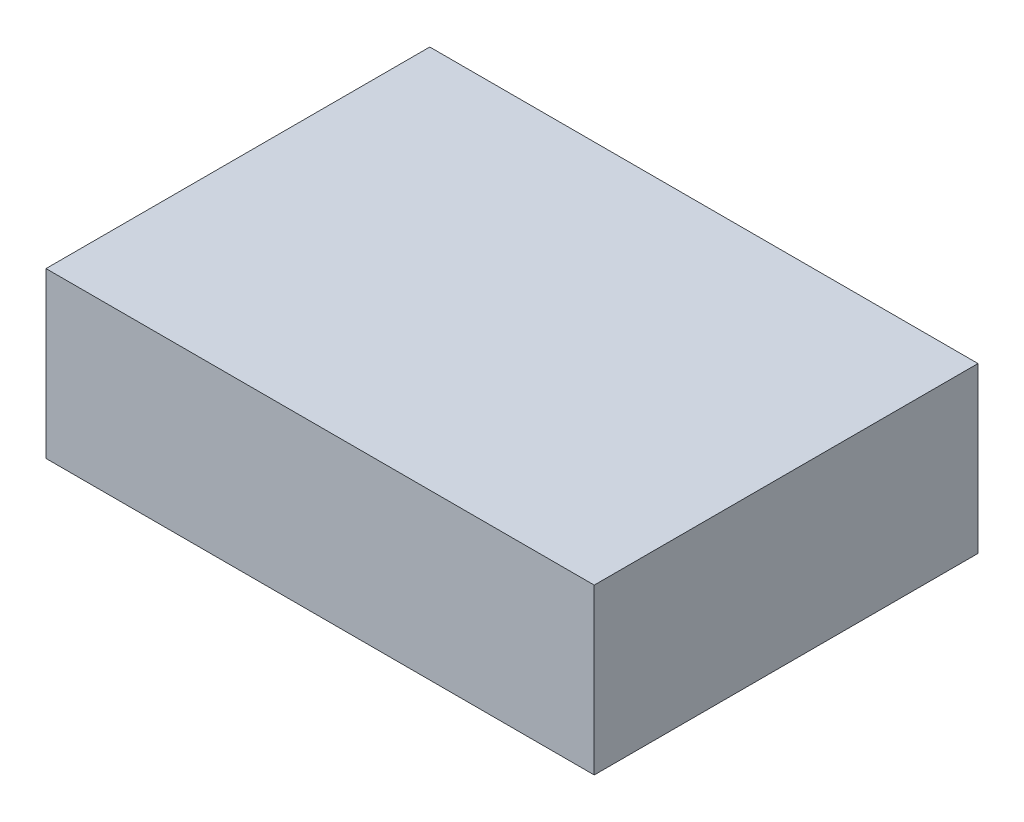
ISO-10303-21;
HEADER;
FILE_DESCRIPTION(('STEP AP214'),'2;1');
FILE_NAME('part.step','',(''),(''),'','','');
FILE_SCHEMA(('AUTOMOTIVE_DESIGN { 1 0 10303 214 1 1 1 1 }'));
ENDSEC;
DATA;
#1=APPLICATION_CONTEXT('core data for automotive mechanical design processes');
#2=APPLICATION_PROTOCOL_DEFINITION('international standard','automotive_design',2000,#1);
#3=PRODUCT_CONTEXT('',#1,'mechanical');
#4=PRODUCT('Part','Part','',(#3));
#5=PRODUCT_RELATED_PRODUCT_CATEGORY('part','',(#4));
#6=PRODUCT_DEFINITION_FORMATION('','',#4);
#7=PRODUCT_DEFINITION_CONTEXT('part definition',#1,'design');
#8=PRODUCT_DEFINITION('design','',#6,#7);
#9=PRODUCT_DEFINITION_SHAPE('','',#8);
#10=(LENGTH_UNIT() NAMED_UNIT(*) SI_UNIT(.MILLI.,.METRE.));
#11=(NAMED_UNIT(*) PLANE_ANGLE_UNIT() SI_UNIT($,.RADIAN.));
#12=(NAMED_UNIT(*) SI_UNIT($,.STERADIAN.) SOLID_ANGLE_UNIT());
#13=UNCERTAINTY_MEASURE_WITH_UNIT(LENGTH_MEASURE(1.E-05),#10,'distance_accuracy_value','');
#14=(GEOMETRIC_REPRESENTATION_CONTEXT(3) GLOBAL_UNCERTAINTY_ASSIGNED_CONTEXT((#13)) GLOBAL_UNIT_ASSIGNED_CONTEXT((#10,
#11,#12)) REPRESENTATION_CONTEXT('',''));
#15=CARTESIAN_POINT('',(0.,0.,0.));
#16=DIRECTION('',(0.,0.,1.));
#17=DIRECTION('',(1.,0.,0.));
#18=AXIS2_PLACEMENT_3D('',#15,#16,#17);
#19=CARTESIAN_POINT('',(-56.2982085514118,30.,-44.7528652372535));
#20=DIRECTION('',(1.,0.,0.));
#21=DIRECTION('',(0.,0.,-1.));
#22=AXIS2_PLACEMENT_3D('',#19,#20,#21);
#23=PLANE('',#22);
#24=DIRECTION('',(0.,0.,1.));
#25=VECTOR('',#24,1.);
#26=CARTESIAN_POINT('',(-56.2982085514118,0.,-44.7528652372535));
#27=LINE('',#26,#25);
#28=CARTESIAN_POINT('',(-56.2982085514118,0.,-44.7528652372535));
#29=VERTEX_POINT('',#28);
#30=CARTESIAN_POINT('',(-56.2982085514118,0.,25.2471347627465));
#31=VERTEX_POINT('',#30);
#32=EDGE_CURVE('E103',#29,#31,#27,.T.);
#33=ORIENTED_EDGE('',*,*,#32,.T.);
#34=DIRECTION('',(0.,-1.,0.));
#35=VECTOR('',#34,1.);
#36=CARTESIAN_POINT('',(-56.2982085514118,30.,25.2471347627465));
#37=LINE('',#36,#35);
#38=CARTESIAN_POINT('',(-56.2982085514118,30.,25.2471347627465));
#39=VERTEX_POINT('',#38);
#40=EDGE_CURVE('E11',#39,#31,#37,.T.);
#41=ORIENTED_EDGE('',*,*,#40,.F.);
#42=DIRECTION('',(0.,0.,1.));
#43=VECTOR('',#42,1.);
#44=CARTESIAN_POINT('',(-56.2982085514118,30.,-44.7528652372535));
#45=LINE('',#44,#43);
#46=CARTESIAN_POINT('',(-56.2982085514118,30.,-44.7528652372535));
#47=VERTEX_POINT('',#46);
#48=EDGE_CURVE('E89',#47,#39,#45,.T.);
#49=ORIENTED_EDGE('',*,*,#48,.F.);
#50=DIRECTION('',(0.,-1.,0.));
#51=VECTOR('',#50,1.);
#52=CARTESIAN_POINT('',(-56.2982085514118,30.,-44.7528652372535));
#53=LINE('',#52,#51);
#54=EDGE_CURVE('E56',#47,#29,#53,.T.);
#55=ORIENTED_EDGE('',*,*,#54,.T.);
#56=EDGE_LOOP('',(#33,#41,#49,#55));
#57=FACE_BOUND('',#56,.T.);
#58=ADVANCED_FACE('F40',(#57),#23,.F.);
#59=CARTESIAN_POINT('',(-56.2982085514118,30.,25.2471347627465));
#60=DIRECTION('',(0.,0.,-1.));
#61=DIRECTION('',(-1.,0.,0.));
#62=AXIS2_PLACEMENT_3D('',#59,#60,#61);
#63=PLANE('',#62);
#64=DIRECTION('',(1.,0.,0.));
#65=VECTOR('',#64,1.);
#66=CARTESIAN_POINT('',(-56.2982085514118,0.,25.2471347627465));
#67=LINE('',#66,#65);
#68=CARTESIAN_POINT('',(43.7017914485883,0.,25.2471347627465));
#69=VERTEX_POINT('',#68);
#70=EDGE_CURVE('E94',#31,#69,#67,.T.);
#71=ORIENTED_EDGE('',*,*,#70,.T.);
#72=DIRECTION('',(0.,-1.,0.));
#73=VECTOR('',#72,1.);
#74=CARTESIAN_POINT('',(43.7017914485883,30.,25.2471347627465));
#75=LINE('',#74,#73);
#76=CARTESIAN_POINT('',(43.7017914485883,30.,25.2471347627465));
#77=VERTEX_POINT('',#76);
#78=EDGE_CURVE('E48',#77,#69,#75,.T.);
#79=ORIENTED_EDGE('',*,*,#78,.F.);
#80=DIRECTION('',(1.,0.,0.));
#81=VECTOR('',#80,1.);
#82=CARTESIAN_POINT('',(-56.2982085514118,30.,25.2471347627465));
#83=LINE('',#82,#81);
#84=EDGE_CURVE('E81',#39,#77,#83,.T.);
#85=ORIENTED_EDGE('',*,*,#84,.F.);
#86=ORIENTED_EDGE('',*,*,#40,.T.);
#87=EDGE_LOOP('',(#71,#79,#85,#86));
#88=FACE_BOUND('',#87,.T.);
#89=ADVANCED_FACE('F93',(#88),#63,.F.);
#90=CARTESIAN_POINT('',(43.7017914485882,30.,-44.7528652372535));
#91=DIRECTION('',(1.,0.,0.));
#92=DIRECTION('',(0.,0.,-1.));
#93=AXIS2_PLACEMENT_3D('',#90,#91,#92);
#94=PLANE('',#93);
#95=DIRECTION('',(0.,0.,1.));
#96=VECTOR('',#95,1.);
#97=CARTESIAN_POINT('',(43.7017914485882,0.,-44.7528652372535));
#98=LINE('',#97,#96);
#99=CARTESIAN_POINT('',(43.7017914485882,0.,-44.7528652372535));
#100=VERTEX_POINT('',#99);
#101=EDGE_CURVE('E106',#100,#69,#98,.T.);
#102=ORIENTED_EDGE('',*,*,#101,.F.);
#103=DIRECTION('',(0.,-1.,0.));
#104=VECTOR('',#103,1.);
#105=CARTESIAN_POINT('',(43.7017914485882,30.,-44.7528652372535));
#106=LINE('',#105,#104);
#107=CARTESIAN_POINT('',(43.7017914485882,30.,-44.7528652372535));
#108=VERTEX_POINT('',#107);
#109=EDGE_CURVE('E70',#108,#100,#106,.T.);
#110=ORIENTED_EDGE('',*,*,#109,.F.);
#111=DIRECTION('',(0.,0.,1.));
#112=VECTOR('',#111,1.);
#113=CARTESIAN_POINT('',(43.7017914485882,30.,-44.7528652372535));
#114=LINE('',#113,#112);
#115=EDGE_CURVE('E88',#108,#77,#114,.T.);
#116=ORIENTED_EDGE('',*,*,#115,.T.);
#117=ORIENTED_EDGE('',*,*,#78,.T.);
#118=EDGE_LOOP('',(#102,#110,#116,#117));
#119=FACE_BOUND('',#118,.T.);
#120=ADVANCED_FACE('F97',(#119),#94,.T.);
#121=CARTESIAN_POINT('',(-56.2982085514118,30.,-44.7528652372535));
#122=DIRECTION('',(0.,0.,-1.));
#123=DIRECTION('',(-1.,0.,0.));
#124=AXIS2_PLACEMENT_3D('',#121,#122,#123);
#125=PLANE('',#124);
#126=DIRECTION('',(1.,0.,0.));
#127=VECTOR('',#126,1.);
#128=CARTESIAN_POINT('',(-56.2982085514118,0.,-44.7528652372535));
#129=LINE('',#128,#127);
#130=EDGE_CURVE('E108',#29,#100,#129,.T.);
#131=ORIENTED_EDGE('',*,*,#130,.F.);
#132=ORIENTED_EDGE('',*,*,#54,.F.);
#133=DIRECTION('',(1.,0.,0.));
#134=VECTOR('',#133,1.);
#135=CARTESIAN_POINT('',(-56.2982085514118,30.,-44.7528652372535));
#136=LINE('',#135,#134);
#137=EDGE_CURVE('E98',#47,#108,#136,.T.);
#138=ORIENTED_EDGE('',*,*,#137,.T.);
#139=ORIENTED_EDGE('',*,*,#109,.T.);
#140=EDGE_LOOP('',(#131,#132,#138,#139));
#141=FACE_BOUND('',#140,.T.);
#142=ADVANCED_FACE('F114',(#141),#125,.T.);
#143=CARTESIAN_POINT('',(0.,30.,0.));
#144=DIRECTION('',(0.,1.,0.));
#145=DIRECTION('',(0.,0.,1.));
#146=AXIS2_PLACEMENT_3D('',#143,#144,#145);
#147=PLANE('',#146);
#148=ORIENTED_EDGE('',*,*,#48,.T.);
#149=ORIENTED_EDGE('',*,*,#84,.T.);
#150=ORIENTED_EDGE('',*,*,#115,.F.);
#151=ORIENTED_EDGE('',*,*,#137,.F.);
#152=EDGE_LOOP('',(#148,#149,#150,#151));
#153=FACE_BOUND('',#152,.T.);
#154=ADVANCED_FACE('F85',(#153),#147,.T.);
#155=CARTESIAN_POINT('',(0.,0.,0.));
#156=DIRECTION('',(0.,1.,0.));
#157=DIRECTION('',(0.,0.,1.));
#158=AXIS2_PLACEMENT_3D('',#155,#156,#157);
#159=PLANE('',#158);
#160=ORIENTED_EDGE('',*,*,#32,.F.);
#161=ORIENTED_EDGE('',*,*,#130,.T.);
#162=ORIENTED_EDGE('',*,*,#101,.T.);
#163=ORIENTED_EDGE('',*,*,#70,.F.);
#164=EDGE_LOOP('',(#160,#161,#162,#163));
#165=FACE_BOUND('',#164,.T.);
#166=ADVANCED_FACE('F113',(#165),#159,.F.);
#167=CLOSED_SHELL('',(#58,#89,#120,#142,#154,#166));
#168=MANIFOLD_SOLID_BREP('B2',#167);
#169=ADVANCED_BREP_SHAPE_REPRESENTATION('',(#18,#168),#14);
#170=SHAPE_DEFINITION_REPRESENTATION(#9,#169);
ENDSEC;
END-ISO-10303-21;
